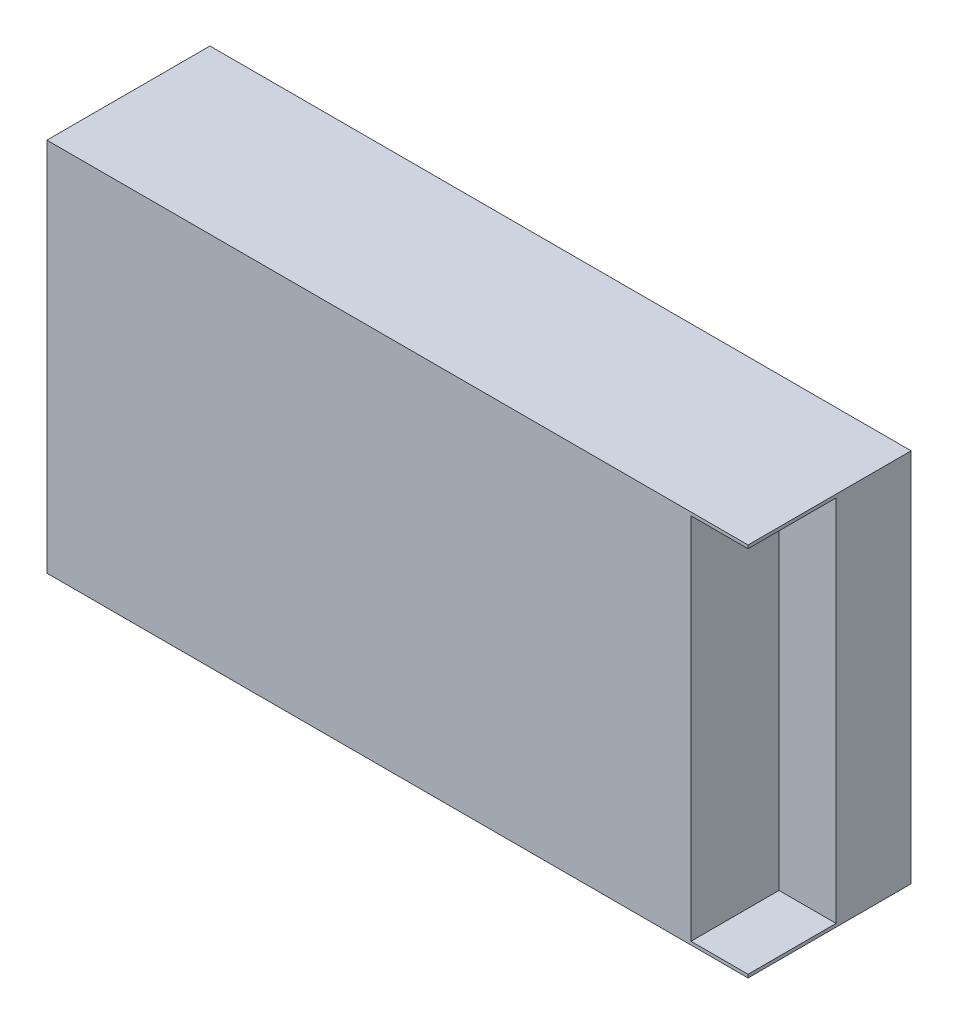
ISO-10303-21;
HEADER;
FILE_DESCRIPTION(('STEP AP214'),'2;1');
FILE_NAME('part.step','',(''),(''),'','','');
FILE_SCHEMA(('AUTOMOTIVE_DESIGN { 1 0 10303 214 1 1 1 1 }'));
ENDSEC;
DATA;
#1=APPLICATION_CONTEXT('core data for automotive mechanical design processes');
#2=APPLICATION_PROTOCOL_DEFINITION('international standard','automotive_design',2000,#1);
#3=PRODUCT_CONTEXT('',#1,'mechanical');
#4=PRODUCT('Part','Part','',(#3));
#5=PRODUCT_RELATED_PRODUCT_CATEGORY('part','',(#4));
#6=PRODUCT_DEFINITION_FORMATION('','',#4);
#7=PRODUCT_DEFINITION_CONTEXT('part definition',#1,'design');
#8=PRODUCT_DEFINITION('design','',#6,#7);
#9=PRODUCT_DEFINITION_SHAPE('','',#8);
#10=(LENGTH_UNIT() NAMED_UNIT(*) SI_UNIT(.MILLI.,.METRE.));
#11=(NAMED_UNIT(*) PLANE_ANGLE_UNIT() SI_UNIT($,.RADIAN.));
#12=(NAMED_UNIT(*) SI_UNIT($,.STERADIAN.) SOLID_ANGLE_UNIT());
#13=UNCERTAINTY_MEASURE_WITH_UNIT(LENGTH_MEASURE(1.E-05),#10,'distance_accuracy_value','');
#14=(GEOMETRIC_REPRESENTATION_CONTEXT(3) GLOBAL_UNCERTAINTY_ASSIGNED_CONTEXT((#13)) GLOBAL_UNIT_ASSIGNED_CONTEXT((#10,
#11,#12)) REPRESENTATION_CONTEXT('',''));
#15=CARTESIAN_POINT('',(0.,0.,0.));
#16=DIRECTION('',(0.,0.,1.));
#17=DIRECTION('',(1.,0.,0.));
#18=AXIS2_PLACEMENT_3D('',#15,#16,#17);
#19=CARTESIAN_POINT('',(0.,0.,50.));
#20=DIRECTION('',(1.,0.,0.));
#21=DIRECTION('',(0.,1.,0.));
#22=AXIS2_PLACEMENT_3D('',#19,#20,#21);
#23=PLANE('',#22);
#24=DIRECTION('',(0.,-1.,0.));
#25=VECTOR('',#24,1.);
#26=CARTESIAN_POINT('',(0.,0.,0.));
#27=LINE('',#26,#25);
#28=CARTESIAN_POINT('',(0.,115.,0.));
#29=VERTEX_POINT('',#28);
#30=CARTESIAN_POINT('',(0.,0.,0.));
#31=VERTEX_POINT('',#30);
#32=EDGE_CURVE('E141',#29,#31,#27,.T.);
#33=ORIENTED_EDGE('',*,*,#32,.T.);
#34=DIRECTION('',(0.,0.,-1.));
#35=VECTOR('',#34,1.);
#36=CARTESIAN_POINT('',(0.,0.,50.));
#37=LINE('',#36,#35);
#38=CARTESIAN_POINT('',(0.,0.,50.));
#39=VERTEX_POINT('',#38);
#40=EDGE_CURVE('E11',#39,#31,#37,.T.);
#41=ORIENTED_EDGE('',*,*,#40,.F.);
#42=DIRECTION('',(0.,-1.,0.));
#43=VECTOR('',#42,1.);
#44=CARTESIAN_POINT('',(0.,0.,50.));
#45=LINE('',#44,#43);
#46=CARTESIAN_POINT('',(0.,115.,50.));
#47=VERTEX_POINT('',#46);
#48=EDGE_CURVE('E133',#47,#39,#45,.T.);
#49=ORIENTED_EDGE('',*,*,#48,.F.);
#50=DIRECTION('',(0.,0.,-1.));
#51=VECTOR('',#50,1.);
#52=CARTESIAN_POINT('',(0.,115.,50.));
#53=LINE('',#52,#51);
#54=EDGE_CURVE('E140',#47,#29,#53,.T.);
#55=ORIENTED_EDGE('',*,*,#54,.T.);
#56=EDGE_LOOP('',(#33,#41,#49,#55));
#57=FACE_BOUND('',#56,.T.);
#58=ADVANCED_FACE('F32',(#57),#23,.F.);
#59=CARTESIAN_POINT('',(0.,0.,50.));
#60=DIRECTION('',(0.,1.,0.));
#61=DIRECTION('',(0.,0.,1.));
#62=AXIS2_PLACEMENT_3D('',#59,#60,#61);
#63=PLANE('',#62);
#64=DIRECTION('',(1.,0.,0.));
#65=VECTOR('',#64,1.);
#66=CARTESIAN_POINT('',(0.,0.,0.));
#67=LINE('',#66,#65);
#68=CARTESIAN_POINT('',(215.,0.,0.));
#69=VERTEX_POINT('',#68);
#70=EDGE_CURVE('E144',#31,#69,#67,.T.);
#71=ORIENTED_EDGE('',*,*,#70,.T.);
#72=DIRECTION('',(0.,0.,-1.));
#73=VECTOR('',#72,1.);
#74=CARTESIAN_POINT('',(215.,0.,50.));
#75=LINE('',#74,#73);
#76=CARTESIAN_POINT('',(215.,0.,50.));
#77=VERTEX_POINT('',#76);
#78=EDGE_CURVE('E39',#77,#69,#75,.T.);
#79=ORIENTED_EDGE('',*,*,#78,.F.);
#80=DIRECTION('',(1.,0.,0.));
#81=VECTOR('',#80,1.);
#82=CARTESIAN_POINT('',(0.,0.,50.));
#83=LINE('',#82,#81);
#84=EDGE_CURVE('E83',#39,#77,#83,.T.);
#85=ORIENTED_EDGE('',*,*,#84,.F.);
#86=ORIENTED_EDGE('',*,*,#40,.T.);
#87=EDGE_LOOP('',(#71,#79,#85,#86));
#88=FACE_BOUND('',#87,.T.);
#89=ADVANCED_FACE('F170',(#88),#63,.F.);
#90=CARTESIAN_POINT('',(215.,0.,50.));
#91=DIRECTION('',(-1.,0.,0.));
#92=DIRECTION('',(0.,-1.,0.));
#93=AXIS2_PLACEMENT_3D('',#90,#91,#92);
#94=PLANE('',#93);
#95=DIRECTION('',(0.,1.,0.));
#96=VECTOR('',#95,1.);
#97=CARTESIAN_POINT('',(215.,114.,23.));
#98=LINE('',#97,#96);
#99=CARTESIAN_POINT('',(215.,1.,23.));
#100=VERTEX_POINT('',#99);
#101=CARTESIAN_POINT('',(215.,114.,23.));
#102=VERTEX_POINT('',#101);
#103=EDGE_CURVE('E112',#100,#102,#98,.T.);
#104=ORIENTED_EDGE('',*,*,#103,.F.);
#105=DIRECTION('',(0.,0.,1.));
#106=VECTOR('',#105,1.);
#107=CARTESIAN_POINT('',(215.,1.,23.));
#108=LINE('',#107,#106);
#109=CARTESIAN_POINT('',(215.,1.,50.));
#110=VERTEX_POINT('',#109);
#111=EDGE_CURVE('E145',#100,#110,#108,.T.);
#112=ORIENTED_EDGE('',*,*,#111,.T.);
#113=DIRECTION('',(0.,1.,0.));
#114=VECTOR('',#113,1.);
#115=CARTESIAN_POINT('',(215.,0.,50.));
#116=LINE('',#115,#114);
#117=EDGE_CURVE('E136',#77,#110,#116,.T.);
#118=ORIENTED_EDGE('',*,*,#117,.F.);
#119=ORIENTED_EDGE('',*,*,#78,.T.);
#120=DIRECTION('',(0.,1.,0.));
#121=VECTOR('',#120,1.);
#122=CARTESIAN_POINT('',(215.,0.,0.));
#123=LINE('',#122,#121);
#124=CARTESIAN_POINT('',(215.,115.,0.));
#125=VERTEX_POINT('',#124);
#126=EDGE_CURVE('E147',#69,#125,#123,.T.);
#127=ORIENTED_EDGE('',*,*,#126,.T.);
#128=DIRECTION('',(0.,0.,-1.));
#129=VECTOR('',#128,1.);
#130=CARTESIAN_POINT('',(215.,115.,50.));
#131=LINE('',#130,#129);
#132=CARTESIAN_POINT('',(215.,115.,50.));
#133=VERTEX_POINT('',#132);
#134=EDGE_CURVE('E151',#133,#125,#131,.T.);
#135=ORIENTED_EDGE('',*,*,#134,.F.);
#136=CARTESIAN_POINT('',(215.,114.,50.));
#137=VERTEX_POINT('',#136);
#138=EDGE_CURVE('E126',#137,#133,#116,.T.);
#139=ORIENTED_EDGE('',*,*,#138,.F.);
#140=DIRECTION('',(0.,0.,1.));
#141=VECTOR('',#140,1.);
#142=CARTESIAN_POINT('',(215.,114.,23.));
#143=LINE('',#142,#141);
#144=EDGE_CURVE('E46',#102,#137,#143,.T.);
#145=ORIENTED_EDGE('',*,*,#144,.F.);
#146=EDGE_LOOP('',(#104,#112,#118,#119,#127,#135,#139,#145));
#147=FACE_BOUND('',#146,.T.);
#148=ADVANCED_FACE('F124',(#147),#94,.F.);
#149=CARTESIAN_POINT('',(0.,115.,50.));
#150=DIRECTION('',(0.,-1.,0.));
#151=DIRECTION('',(0.,0.,-1.));
#152=AXIS2_PLACEMENT_3D('',#149,#150,#151);
#153=PLANE('',#152);
#154=DIRECTION('',(-1.,0.,0.));
#155=VECTOR('',#154,1.);
#156=CARTESIAN_POINT('',(0.,115.,0.));
#157=LINE('',#156,#155);
#158=EDGE_CURVE('E76',#125,#29,#157,.T.);
#159=ORIENTED_EDGE('',*,*,#158,.T.);
#160=ORIENTED_EDGE('',*,*,#54,.F.);
#161=DIRECTION('',(-1.,0.,0.));
#162=VECTOR('',#161,1.);
#163=CARTESIAN_POINT('',(0.,115.,50.));
#164=LINE('',#163,#162);
#165=EDGE_CURVE('E55',#133,#47,#164,.T.);
#166=ORIENTED_EDGE('',*,*,#165,.F.);
#167=ORIENTED_EDGE('',*,*,#134,.T.);
#168=EDGE_LOOP('',(#159,#160,#166,#167));
#169=FACE_BOUND('',#168,.T.);
#170=ADVANCED_FACE('F161',(#169),#153,.F.);
#171=CARTESIAN_POINT('',(0.,0.,50.));
#172=DIRECTION('',(0.,0.,-1.));
#173=DIRECTION('',(-1.,0.,0.));
#174=AXIS2_PLACEMENT_3D('',#171,#172,#173);
#175=PLANE('',#174);
#176=ORIENTED_EDGE('',*,*,#117,.T.);
#177=DIRECTION('',(1.,0.,0.));
#178=VECTOR('',#177,1.);
#179=CARTESIAN_POINT('',(215.,1.,50.));
#180=LINE('',#179,#178);
#181=CARTESIAN_POINT('',(197.5,1.,50.));
#182=VERTEX_POINT('',#181);
#183=EDGE_CURVE('E121',#182,#110,#180,.T.);
#184=ORIENTED_EDGE('',*,*,#183,.F.);
#185=DIRECTION('',(0.,-1.,0.));
#186=VECTOR('',#185,1.);
#187=CARTESIAN_POINT('',(197.5,114.,50.));
#188=LINE('',#187,#186);
#189=CARTESIAN_POINT('',(197.5,114.,50.));
#190=VERTEX_POINT('',#189);
#191=EDGE_CURVE('E237',#190,#182,#188,.T.);
#192=ORIENTED_EDGE('',*,*,#191,.F.);
#193=DIRECTION('',(-1.,0.,0.));
#194=VECTOR('',#193,1.);
#195=CARTESIAN_POINT('',(215.,114.,50.));
#196=LINE('',#195,#194);
#197=EDGE_CURVE('E239',#137,#190,#196,.T.);
#198=ORIENTED_EDGE('',*,*,#197,.F.);
#199=ORIENTED_EDGE('',*,*,#138,.T.);
#200=ORIENTED_EDGE('',*,*,#165,.T.);
#201=ORIENTED_EDGE('',*,*,#48,.T.);
#202=ORIENTED_EDGE('',*,*,#84,.T.);
#203=EDGE_LOOP('',(#176,#184,#192,#198,#199,#200,#201,#202));
#204=FACE_BOUND('',#203,.T.);
#205=ADVANCED_FACE('F163',(#204),#175,.F.);
#206=CARTESIAN_POINT('',(0.,0.,0.));
#207=DIRECTION('',(0.,0.,-1.));
#208=DIRECTION('',(-1.,0.,0.));
#209=AXIS2_PLACEMENT_3D('',#206,#207,#208);
#210=PLANE('',#209);
#211=ORIENTED_EDGE('',*,*,#32,.F.);
#212=ORIENTED_EDGE('',*,*,#158,.F.);
#213=ORIENTED_EDGE('',*,*,#126,.F.);
#214=ORIENTED_EDGE('',*,*,#70,.F.);
#215=EDGE_LOOP('',(#211,#212,#213,#214));
#216=FACE_BOUND('',#215,.T.);
#217=ADVANCED_FACE('F157',(#216),#210,.T.);
#218=CARTESIAN_POINT('',(215.,1.,23.));
#219=DIRECTION('',(0.,-1.,0.));
#220=DIRECTION('',(1.,0.,0.));
#221=AXIS2_PLACEMENT_3D('',#218,#219,#220);
#222=PLANE('',#221);
#223=ORIENTED_EDGE('',*,*,#183,.T.);
#224=ORIENTED_EDGE('',*,*,#111,.F.);
#225=DIRECTION('',(1.,0.,0.));
#226=VECTOR('',#225,1.);
#227=CARTESIAN_POINT('',(215.,1.,23.));
#228=LINE('',#227,#226);
#229=CARTESIAN_POINT('',(197.5,1.,23.));
#230=VERTEX_POINT('',#229);
#231=EDGE_CURVE('E118',#230,#100,#228,.T.);
#232=ORIENTED_EDGE('',*,*,#231,.F.);
#233=DIRECTION('',(0.,0.,1.));
#234=VECTOR('',#233,1.);
#235=CARTESIAN_POINT('',(197.5,1.,23.));
#236=LINE('',#235,#234);
#237=EDGE_CURVE('E128',#230,#182,#236,.T.);
#238=ORIENTED_EDGE('',*,*,#237,.T.);
#239=EDGE_LOOP('',(#223,#224,#232,#238));
#240=FACE_BOUND('',#239,.T.);
#241=ADVANCED_FACE('F199',(#240),#222,.F.);
#242=CARTESIAN_POINT('',(197.5,114.,23.));
#243=DIRECTION('',(-1.,0.,0.));
#244=DIRECTION('',(0.,0.,1.));
#245=AXIS2_PLACEMENT_3D('',#242,#243,#244);
#246=PLANE('',#245);
#247=ORIENTED_EDGE('',*,*,#191,.T.);
#248=ORIENTED_EDGE('',*,*,#237,.F.);
#249=DIRECTION('',(0.,-1.,0.));
#250=VECTOR('',#249,1.);
#251=CARTESIAN_POINT('',(197.5,114.,23.));
#252=LINE('',#251,#250);
#253=CARTESIAN_POINT('',(197.5,114.,23.));
#254=VERTEX_POINT('',#253);
#255=EDGE_CURVE('E111',#254,#230,#252,.T.);
#256=ORIENTED_EDGE('',*,*,#255,.F.);
#257=DIRECTION('',(0.,0.,1.));
#258=VECTOR('',#257,1.);
#259=CARTESIAN_POINT('',(197.5,114.,23.));
#260=LINE('',#259,#258);
#261=EDGE_CURVE('E107',#254,#190,#260,.T.);
#262=ORIENTED_EDGE('',*,*,#261,.T.);
#263=EDGE_LOOP('',(#247,#248,#256,#262));
#264=FACE_BOUND('',#263,.T.);
#265=ADVANCED_FACE('F204',(#264),#246,.F.);
#266=CARTESIAN_POINT('',(215.,114.,23.));
#267=DIRECTION('',(0.,1.,0.));
#268=DIRECTION('',(0.,0.,1.));
#269=AXIS2_PLACEMENT_3D('',#266,#267,#268);
#270=PLANE('',#269);
#271=ORIENTED_EDGE('',*,*,#197,.T.);
#272=ORIENTED_EDGE('',*,*,#261,.F.);
#273=DIRECTION('',(-1.,0.,0.));
#274=VECTOR('',#273,1.);
#275=CARTESIAN_POINT('',(215.,114.,23.));
#276=LINE('',#275,#274);
#277=EDGE_CURVE('E104',#102,#254,#276,.T.);
#278=ORIENTED_EDGE('',*,*,#277,.F.);
#279=ORIENTED_EDGE('',*,*,#144,.T.);
#280=EDGE_LOOP('',(#271,#272,#278,#279));
#281=FACE_BOUND('',#280,.T.);
#282=ADVANCED_FACE('F106',(#281),#270,.F.);
#283=CARTESIAN_POINT('',(0.,0.,23.));
#284=DIRECTION('',(0.,0.,-1.));
#285=DIRECTION('',(-1.,0.,0.));
#286=AXIS2_PLACEMENT_3D('',#283,#284,#285);
#287=PLANE('',#286);
#288=ORIENTED_EDGE('',*,*,#103,.T.);
#289=ORIENTED_EDGE('',*,*,#277,.T.);
#290=ORIENTED_EDGE('',*,*,#255,.T.);
#291=ORIENTED_EDGE('',*,*,#231,.T.);
#292=EDGE_LOOP('',(#288,#289,#290,#291));
#293=FACE_BOUND('',#292,.T.);
#294=ADVANCED_FACE('F116',(#293),#287,.F.);
#295=CLOSED_SHELL('',(#58,#89,#148,#170,#205,#217,#241,#265,#282,#294));
#296=MANIFOLD_SOLID_BREP('B2',#295);
#297=ADVANCED_BREP_SHAPE_REPRESENTATION('',(#18,#296),#14);
#298=SHAPE_DEFINITION_REPRESENTATION(#9,#297);
ENDSEC;
END-ISO-10303-21;
